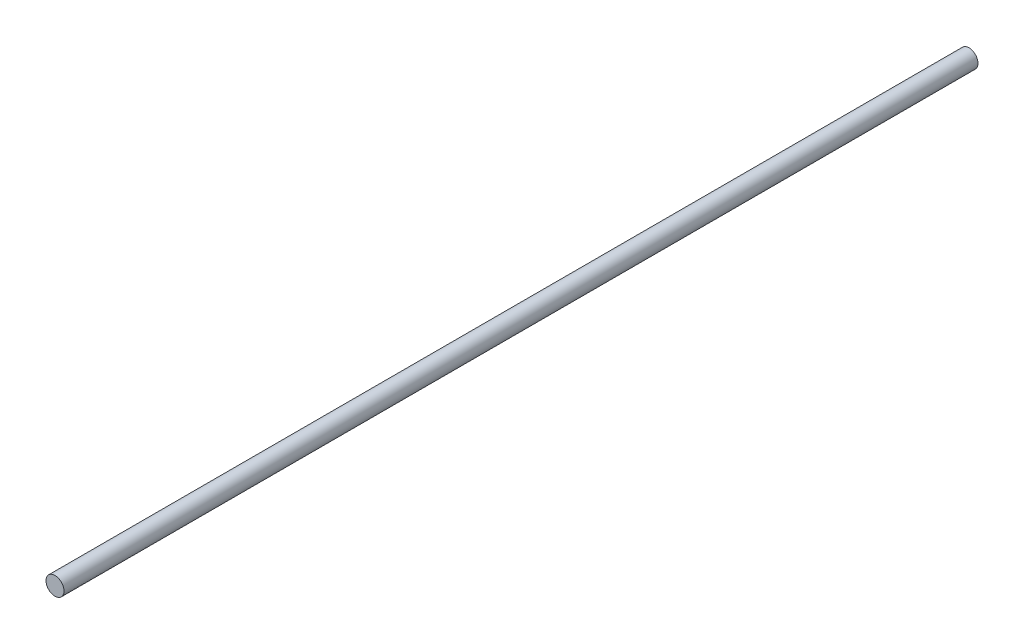
ISO-10303-21;
HEADER;
FILE_DESCRIPTION(('STEP AP214'),'2;1');
FILE_NAME('part.step','',(''),(''),'','','');
FILE_SCHEMA(('AUTOMOTIVE_DESIGN { 1 0 10303 214 1 1 1 1 }'));
ENDSEC;
DATA;
#1=APPLICATION_CONTEXT('core data for automotive mechanical design processes');
#2=APPLICATION_PROTOCOL_DEFINITION('international standard','automotive_design',2000,#1);
#3=PRODUCT_CONTEXT('',#1,'mechanical');
#4=PRODUCT('Part','Part','',(#3));
#5=PRODUCT_RELATED_PRODUCT_CATEGORY('part','',(#4));
#6=PRODUCT_DEFINITION_FORMATION('','',#4);
#7=PRODUCT_DEFINITION_CONTEXT('part definition',#1,'design');
#8=PRODUCT_DEFINITION('design','',#6,#7);
#9=PRODUCT_DEFINITION_SHAPE('','',#8);
#10=(LENGTH_UNIT() NAMED_UNIT(*) SI_UNIT(.MILLI.,.METRE.));
#11=(NAMED_UNIT(*) PLANE_ANGLE_UNIT() SI_UNIT($,.RADIAN.));
#12=(NAMED_UNIT(*) SI_UNIT($,.STERADIAN.) SOLID_ANGLE_UNIT());
#13=UNCERTAINTY_MEASURE_WITH_UNIT(LENGTH_MEASURE(1.E-05),#10,'distance_accuracy_value','');
#14=(GEOMETRIC_REPRESENTATION_CONTEXT(3) GLOBAL_UNCERTAINTY_ASSIGNED_CONTEXT((#13)) GLOBAL_UNIT_ASSIGNED_CONTEXT((#10,
#11,#12)) REPRESENTATION_CONTEXT('',''));
#15=CARTESIAN_POINT('',(0.,0.,0.));
#16=DIRECTION('',(0.,0.,1.));
#17=DIRECTION('',(1.,0.,0.));
#18=AXIS2_PLACEMENT_3D('',#15,#16,#17);
#19=CARTESIAN_POINT('',(0.,0.,72.9));
#20=DIRECTION('',(0.,0.,-1.));
#21=DIRECTION('',(-1.,0.,0.));
#22=AXIS2_PLACEMENT_3D('',#19,#20,#21);
#23=PLANE('',#22);
#24=CARTESIAN_POINT('',(0.,0.,72.9));
#25=DIRECTION('',(0.,0.,1.));
#26=DIRECTION('',(1.,0.,0.));
#27=AXIS2_PLACEMENT_3D('',#24,#25,#26);
#28=CIRCLE('',#27,4.);
#29=CARTESIAN_POINT('',(4.,0.,72.9));
#30=VERTEX_POINT('',#29);
#31=EDGE_CURVE('E10',#30,#30,#28,.T.);
#32=ORIENTED_EDGE('',*,*,#31,.T.);
#33=EDGE_LOOP('',(#32));
#34=FACE_BOUND('',#33,.T.);
#35=ADVANCED_FACE('F32',(#34),#23,.F.);
#36=CARTESIAN_POINT('',(0.,0.,72.9));
#37=DIRECTION('',(0.,0.,1.));
#38=DIRECTION('',(1.,0.,0.));
#39=AXIS2_PLACEMENT_3D('',#36,#37,#38);
#40=CYLINDRICAL_SURFACE('',#39,4.);
#41=ORIENTED_EDGE('',*,*,#31,.F.);
#42=EDGE_LOOP('',(#41));
#43=FACE_BOUND('',#42,.T.);
#44=CARTESIAN_POINT('',(0.,0.,-332.9));
#45=DIRECTION('',(0.,0.,1.));
#46=DIRECTION('',(1.,0.,0.));
#47=AXIS2_PLACEMENT_3D('',#44,#45,#46);
#48=CIRCLE('',#47,4.);
#49=CARTESIAN_POINT('',(4.,0.,-332.9));
#50=VERTEX_POINT('',#49);
#51=EDGE_CURVE('E38',#50,#50,#48,.T.);
#52=ORIENTED_EDGE('',*,*,#51,.T.);
#53=EDGE_LOOP('',(#52));
#54=FACE_BOUND('',#53,.T.);
#55=ADVANCED_FACE('F44',(#43,#54),#40,.T.);
#56=CARTESIAN_POINT('',(0.,0.,-332.9));
#57=DIRECTION('',(0.,0.,1.));
#58=DIRECTION('',(1.,0.,0.));
#59=AXIS2_PLACEMENT_3D('',#56,#57,#58);
#60=PLANE('',#59);
#61=ORIENTED_EDGE('',*,*,#51,.F.);
#62=EDGE_LOOP('',(#61));
#63=FACE_BOUND('',#62,.T.);
#64=ADVANCED_FACE('F46',(#63),#60,.F.);
#65=CLOSED_SHELL('',(#35,#55,#64));
#66=MANIFOLD_SOLID_BREP('B2',#65);
#67=ADVANCED_BREP_SHAPE_REPRESENTATION('',(#18,#66),#14);
#68=SHAPE_DEFINITION_REPRESENTATION(#9,#67);
ENDSEC;
END-ISO-10303-21;
